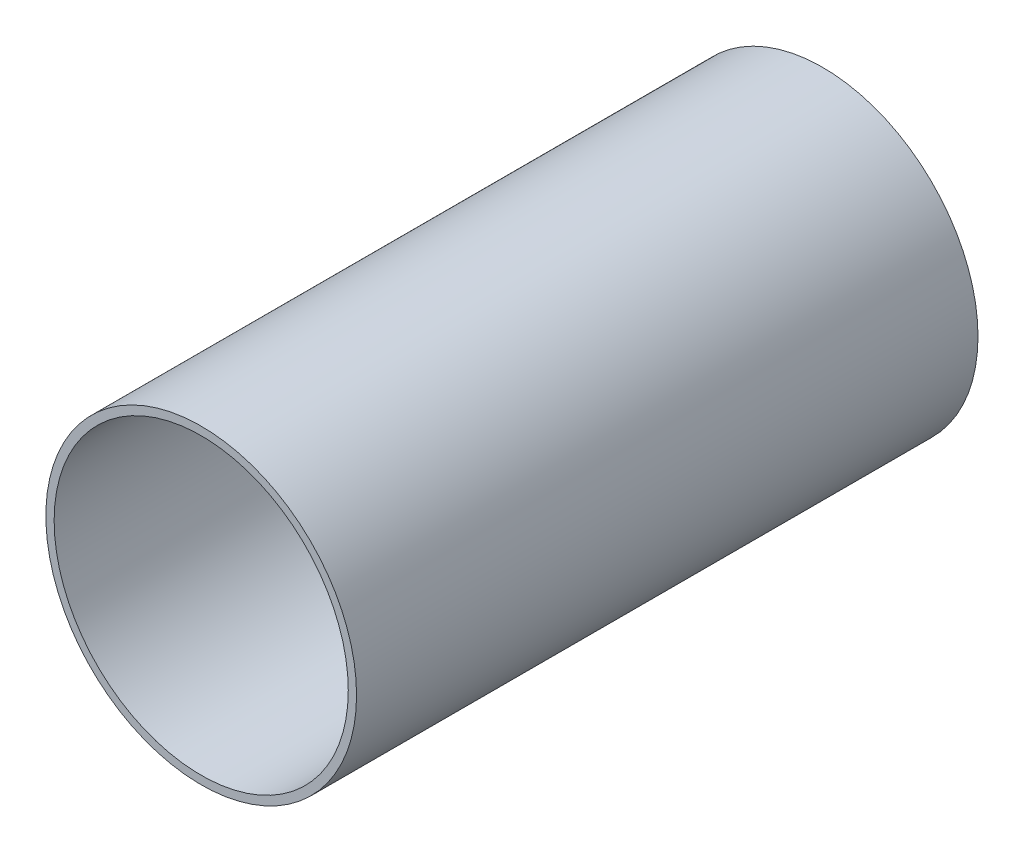
ISO-10303-21;
HEADER;
FILE_DESCRIPTION(('STEP AP214'),'2;1');
FILE_NAME('part.step','',(''),(''),'','','');
FILE_SCHEMA(('AUTOMOTIVE_DESIGN { 1 0 10303 214 1 1 1 1 }'));
ENDSEC;
DATA;
#1=APPLICATION_CONTEXT('core data for automotive mechanical design processes');
#2=APPLICATION_PROTOCOL_DEFINITION('international standard','automotive_design',2000,#1);
#3=PRODUCT_CONTEXT('',#1,'mechanical');
#4=PRODUCT('Part','Part','',(#3));
#5=PRODUCT_RELATED_PRODUCT_CATEGORY('part','',(#4));
#6=PRODUCT_DEFINITION_FORMATION('','',#4);
#7=PRODUCT_DEFINITION_CONTEXT('part definition',#1,'design');
#8=PRODUCT_DEFINITION('design','',#6,#7);
#9=PRODUCT_DEFINITION_SHAPE('','',#8);
#10=(LENGTH_UNIT() NAMED_UNIT(*) SI_UNIT(.MILLI.,.METRE.));
#11=(NAMED_UNIT(*) PLANE_ANGLE_UNIT() SI_UNIT($,.RADIAN.));
#12=(NAMED_UNIT(*) SI_UNIT($,.STERADIAN.) SOLID_ANGLE_UNIT());
#13=UNCERTAINTY_MEASURE_WITH_UNIT(LENGTH_MEASURE(1.E-05),#10,'distance_accuracy_value','');
#14=(GEOMETRIC_REPRESENTATION_CONTEXT(3) GLOBAL_UNCERTAINTY_ASSIGNED_CONTEXT((#13)) GLOBAL_UNIT_ASSIGNED_CONTEXT((#10,
#11,#12)) REPRESENTATION_CONTEXT('',''));
#15=CARTESIAN_POINT('',(0.,0.,0.));
#16=DIRECTION('',(0.,0.,1.));
#17=DIRECTION('',(1.,0.,0.));
#18=AXIS2_PLACEMENT_3D('',#15,#16,#17);
#19=CARTESIAN_POINT('',(-54.7806804509473,32.3956815864739,150.));
#20=DIRECTION('',(0.,0.,1.));
#21=DIRECTION('',(1.,0.,0.));
#22=AXIS2_PLACEMENT_3D('',#19,#20,#21);
#23=PLANE('',#22);
#24=CARTESIAN_POINT('',(-54.7806804509473,32.3956815864739,150.));
#25=DIRECTION('',(0.,0.,1.));
#26=DIRECTION('',(1.,0.,0.));
#27=AXIS2_PLACEMENT_3D('',#24,#25,#26);
#28=CIRCLE('',#27,37.5);
#29=CARTESIAN_POINT('',(-17.2806804509472,32.3956815864739,150.));
#30=VERTEX_POINT('',#29);
#31=EDGE_CURVE('E10',#30,#30,#28,.T.);
#32=ORIENTED_EDGE('',*,*,#31,.T.);
#33=EDGE_LOOP('',(#32));
#34=FACE_BOUND('',#33,.T.);
#35=CARTESIAN_POINT('',(-54.7806804509473,32.3956815864739,150.));
#36=DIRECTION('',(0.,0.,1.));
#37=DIRECTION('',(1.,0.,0.));
#38=AXIS2_PLACEMENT_3D('',#35,#36,#37);
#39=CIRCLE('',#38,35.5);
#40=CARTESIAN_POINT('',(-19.2806804509472,32.3956815864739,150.));
#41=VERTEX_POINT('',#40);
#42=EDGE_CURVE('E56',#41,#41,#39,.T.);
#43=ORIENTED_EDGE('',*,*,#42,.F.);
#44=EDGE_LOOP('',(#43));
#45=FACE_BOUND('',#44,.T.);
#46=ADVANCED_FACE('F43',(#34,#45),#23,.T.);
#47=CARTESIAN_POINT('',(-54.7806804509473,32.3956815864739,0.));
#48=DIRECTION('',(0.,0.,1.));
#49=DIRECTION('',(1.,0.,0.));
#50=AXIS2_PLACEMENT_3D('',#47,#48,#49);
#51=PLANE('',#50);
#52=CARTESIAN_POINT('',(-54.7806804509473,32.3956815864739,0.));
#53=DIRECTION('',(0.,0.,1.));
#54=DIRECTION('',(1.,0.,0.));
#55=AXIS2_PLACEMENT_3D('',#52,#53,#54);
#56=CIRCLE('',#55,37.5);
#57=CARTESIAN_POINT('',(-17.2806804509472,32.3956815864739,0.));
#58=VERTEX_POINT('',#57);
#59=EDGE_CURVE('E47',#58,#58,#56,.T.);
#60=ORIENTED_EDGE('',*,*,#59,.F.);
#61=EDGE_LOOP('',(#60));
#62=FACE_BOUND('',#61,.T.);
#63=CARTESIAN_POINT('',(-54.7806804509473,32.3956815864739,0.));
#64=DIRECTION('',(0.,0.,1.));
#65=DIRECTION('',(1.,0.,0.));
#66=AXIS2_PLACEMENT_3D('',#63,#64,#65);
#67=CIRCLE('',#66,35.5);
#68=CARTESIAN_POINT('',(-19.2806804509472,32.3956815864739,0.));
#69=VERTEX_POINT('',#68);
#70=EDGE_CURVE('E58',#69,#69,#67,.T.);
#71=ORIENTED_EDGE('',*,*,#70,.T.);
#72=EDGE_LOOP('',(#71));
#73=FACE_BOUND('',#72,.T.);
#74=ADVANCED_FACE('F70',(#62,#73),#51,.F.);
#75=CARTESIAN_POINT('',(-54.7806804509473,32.3956815864739,150.));
#76=DIRECTION('',(0.,0.,-1.));
#77=DIRECTION('',(-1.,0.,0.));
#78=AXIS2_PLACEMENT_3D('',#75,#76,#77);
#79=CYLINDRICAL_SURFACE('',#78,37.5);
#80=ORIENTED_EDGE('',*,*,#31,.F.);
#81=EDGE_LOOP('',(#80));
#82=FACE_BOUND('',#81,.T.);
#83=ORIENTED_EDGE('',*,*,#59,.T.);
#84=EDGE_LOOP('',(#83));
#85=FACE_BOUND('',#84,.T.);
#86=ADVANCED_FACE('F45',(#82,#85),#79,.T.);
#87=CARTESIAN_POINT('',(-54.7806804509473,32.3956815864739,150.));
#88=DIRECTION('',(0.,0.,-1.));
#89=DIRECTION('',(-1.,0.,0.));
#90=AXIS2_PLACEMENT_3D('',#87,#88,#89);
#91=CYLINDRICAL_SURFACE('',#90,35.5);
#92=ORIENTED_EDGE('',*,*,#42,.T.);
#93=EDGE_LOOP('',(#92));
#94=FACE_BOUND('',#93,.T.);
#95=ORIENTED_EDGE('',*,*,#70,.F.);
#96=EDGE_LOOP('',(#95));
#97=FACE_BOUND('',#96,.T.);
#98=ADVANCED_FACE('F66',(#94,#97),#91,.F.);
#99=CLOSED_SHELL('',(#46,#74,#86,#98));
#100=MANIFOLD_SOLID_BREP('B2',#99);
#101=ADVANCED_BREP_SHAPE_REPRESENTATION('',(#18,#100),#14);
#102=SHAPE_DEFINITION_REPRESENTATION(#9,#101);
ENDSEC;
END-ISO-10303-21;
